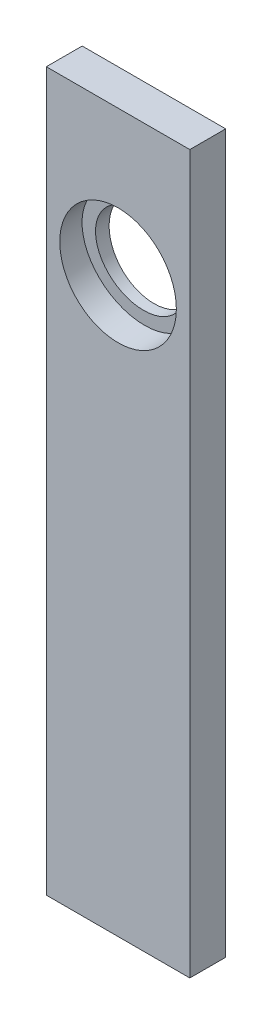
ISO-10303-21;
HEADER;
FILE_DESCRIPTION(('STEP AP214'),'2;1');
FILE_NAME('part.step','',(''),(''),'','','');
FILE_SCHEMA(('AUTOMOTIVE_DESIGN { 1 0 10303 214 1 1 1 1 }'));
ENDSEC;
DATA;
#1=APPLICATION_CONTEXT('core data for automotive mechanical design processes');
#2=APPLICATION_PROTOCOL_DEFINITION('international standard','automotive_design',2000,#1);
#3=PRODUCT_CONTEXT('',#1,'mechanical');
#4=PRODUCT('Part','Part','',(#3));
#5=PRODUCT_RELATED_PRODUCT_CATEGORY('part','',(#4));
#6=PRODUCT_DEFINITION_FORMATION('','',#4);
#7=PRODUCT_DEFINITION_CONTEXT('part definition',#1,'design');
#8=PRODUCT_DEFINITION('design','',#6,#7);
#9=PRODUCT_DEFINITION_SHAPE('','',#8);
#10=(LENGTH_UNIT() NAMED_UNIT(*) SI_UNIT(.MILLI.,.METRE.));
#11=(NAMED_UNIT(*) PLANE_ANGLE_UNIT() SI_UNIT($,.RADIAN.));
#12=(NAMED_UNIT(*) SI_UNIT($,.STERADIAN.) SOLID_ANGLE_UNIT());
#13=UNCERTAINTY_MEASURE_WITH_UNIT(LENGTH_MEASURE(1.E-05),#10,'distance_accuracy_value','');
#14=(GEOMETRIC_REPRESENTATION_CONTEXT(3) GLOBAL_UNCERTAINTY_ASSIGNED_CONTEXT((#13)) GLOBAL_UNIT_ASSIGNED_CONTEXT((#10,
#11,#12)) REPRESENTATION_CONTEXT('',''));
#15=CARTESIAN_POINT('',(0.,0.,0.));
#16=DIRECTION('',(0.,0.,1.));
#17=DIRECTION('',(1.,0.,0.));
#18=AXIS2_PLACEMENT_3D('',#15,#16,#17);
#19=CARTESIAN_POINT('',(40.,200.,20.));
#20=DIRECTION('',(-1.,0.,0.));
#21=DIRECTION('',(0.,-1.,0.));
#22=AXIS2_PLACEMENT_3D('',#19,#20,#21);
#23=PLANE('',#22);
#24=DIRECTION('',(0.,1.,0.));
#25=VECTOR('',#24,1.);
#26=CARTESIAN_POINT('',(40.,200.,0.));
#27=LINE('',#26,#25);
#28=CARTESIAN_POINT('',(40.,-200.,0.));
#29=VERTEX_POINT('',#28);
#30=CARTESIAN_POINT('',(40.,200.,0.));
#31=VERTEX_POINT('',#30);
#32=EDGE_CURVE('E110',#29,#31,#27,.T.);
#33=ORIENTED_EDGE('',*,*,#32,.T.);
#34=DIRECTION('',(0.,0.,-1.));
#35=VECTOR('',#34,1.);
#36=CARTESIAN_POINT('',(40.,200.,20.));
#37=LINE('',#36,#35);
#38=CARTESIAN_POINT('',(40.,200.,20.));
#39=VERTEX_POINT('',#38);
#40=EDGE_CURVE('E11',#39,#31,#37,.T.);
#41=ORIENTED_EDGE('',*,*,#40,.F.);
#42=DIRECTION('',(0.,1.,0.));
#43=VECTOR('',#42,1.);
#44=CARTESIAN_POINT('',(40.,200.,20.));
#45=LINE('',#44,#43);
#46=CARTESIAN_POINT('',(40.,-200.,20.));
#47=VERTEX_POINT('',#46);
#48=EDGE_CURVE('E93',#47,#39,#45,.T.);
#49=ORIENTED_EDGE('',*,*,#48,.F.);
#50=DIRECTION('',(0.,0.,-1.));
#51=VECTOR('',#50,1.);
#52=CARTESIAN_POINT('',(40.,-200.,20.));
#53=LINE('',#52,#51);
#54=EDGE_CURVE('E106',#47,#29,#53,.T.);
#55=ORIENTED_EDGE('',*,*,#54,.T.);
#56=EDGE_LOOP('',(#33,#41,#49,#55));
#57=FACE_BOUND('',#56,.T.);
#58=ADVANCED_FACE('F39',(#57),#23,.F.);
#59=CARTESIAN_POINT('',(-40.,200.,20.));
#60=DIRECTION('',(0.,-1.,0.));
#61=DIRECTION('',(0.,0.,-1.));
#62=AXIS2_PLACEMENT_3D('',#59,#60,#61);
#63=PLANE('',#62);
#64=DIRECTION('',(-1.,0.,0.));
#65=VECTOR('',#64,1.);
#66=CARTESIAN_POINT('',(-40.,200.,0.));
#67=LINE('',#66,#65);
#68=CARTESIAN_POINT('',(-40.,200.,0.));
#69=VERTEX_POINT('',#68);
#70=EDGE_CURVE('E98',#31,#69,#67,.T.);
#71=ORIENTED_EDGE('',*,*,#70,.T.);
#72=DIRECTION('',(0.,0.,-1.));
#73=VECTOR('',#72,1.);
#74=CARTESIAN_POINT('',(-40.,200.,20.));
#75=LINE('',#74,#73);
#76=CARTESIAN_POINT('',(-40.,200.,20.));
#77=VERTEX_POINT('',#76);
#78=EDGE_CURVE('E49',#77,#69,#75,.T.);
#79=ORIENTED_EDGE('',*,*,#78,.F.);
#80=DIRECTION('',(-1.,0.,0.));
#81=VECTOR('',#80,1.);
#82=CARTESIAN_POINT('',(-40.,200.,20.));
#83=LINE('',#82,#81);
#84=EDGE_CURVE('E88',#39,#77,#83,.T.);
#85=ORIENTED_EDGE('',*,*,#84,.F.);
#86=ORIENTED_EDGE('',*,*,#40,.T.);
#87=EDGE_LOOP('',(#71,#79,#85,#86));
#88=FACE_BOUND('',#87,.T.);
#89=ADVANCED_FACE('F97',(#88),#63,.F.);
#90=CARTESIAN_POINT('',(-40.,200.,20.));
#91=DIRECTION('',(1.,0.,0.));
#92=DIRECTION('',(0.,1.,0.));
#93=AXIS2_PLACEMENT_3D('',#90,#91,#92);
#94=PLANE('',#93);
#95=DIRECTION('',(0.,-1.,0.));
#96=VECTOR('',#95,1.);
#97=CARTESIAN_POINT('',(-40.,200.,0.));
#98=LINE('',#97,#96);
#99=CARTESIAN_POINT('',(-40.,-200.,0.));
#100=VERTEX_POINT('',#99);
#101=EDGE_CURVE('E75',#69,#100,#98,.T.);
#102=ORIENTED_EDGE('',*,*,#101,.T.);
#103=DIRECTION('',(0.,0.,-1.));
#104=VECTOR('',#103,1.);
#105=CARTESIAN_POINT('',(-40.,-200.,20.));
#106=LINE('',#105,#104);
#107=CARTESIAN_POINT('',(-40.,-200.,20.));
#108=VERTEX_POINT('',#107);
#109=EDGE_CURVE('E100',#108,#100,#106,.T.);
#110=ORIENTED_EDGE('',*,*,#109,.F.);
#111=DIRECTION('',(0.,-1.,0.));
#112=VECTOR('',#111,1.);
#113=CARTESIAN_POINT('',(-40.,200.,20.));
#114=LINE('',#113,#112);
#115=EDGE_CURVE('E91',#77,#108,#114,.T.);
#116=ORIENTED_EDGE('',*,*,#115,.F.);
#117=ORIENTED_EDGE('',*,*,#78,.T.);
#118=EDGE_LOOP('',(#102,#110,#116,#117));
#119=FACE_BOUND('',#118,.T.);
#120=ADVANCED_FACE('F102',(#119),#94,.F.);
#121=CARTESIAN_POINT('',(-40.,-200.,20.));
#122=DIRECTION('',(0.,1.,0.));
#123=DIRECTION('',(0.,0.,1.));
#124=AXIS2_PLACEMENT_3D('',#121,#122,#123);
#125=PLANE('',#124);
#126=DIRECTION('',(1.,0.,0.));
#127=VECTOR('',#126,1.);
#128=CARTESIAN_POINT('',(-40.,-200.,0.));
#129=LINE('',#128,#127);
#130=EDGE_CURVE('E81',#100,#29,#129,.T.);
#131=ORIENTED_EDGE('',*,*,#130,.T.);
#132=ORIENTED_EDGE('',*,*,#54,.F.);
#133=DIRECTION('',(1.,0.,0.));
#134=VECTOR('',#133,1.);
#135=CARTESIAN_POINT('',(-40.,-200.,20.));
#136=LINE('',#135,#134);
#137=EDGE_CURVE('E58',#108,#47,#136,.T.);
#138=ORIENTED_EDGE('',*,*,#137,.F.);
#139=ORIENTED_EDGE('',*,*,#109,.T.);
#140=EDGE_LOOP('',(#131,#132,#138,#139));
#141=FACE_BOUND('',#140,.T.);
#142=ADVANCED_FACE('F171',(#141),#125,.F.);
#143=CARTESIAN_POINT('',(0.,0.,20.));
#144=DIRECTION('',(0.,0.,1.));
#145=DIRECTION('',(1.,0.,0.));
#146=AXIS2_PLACEMENT_3D('',#143,#144,#145);
#147=PLANE('',#146);
#148=CARTESIAN_POINT('',(0.,119.300731880565,20.));
#149=DIRECTION('',(0.,0.,1.));
#150=DIRECTION('',(0.,1.,0.));
#151=AXIS2_PLACEMENT_3D('',#148,#149,#150);
#152=ELLIPSE('',#151,32.5793616876381,32.5);
#153=CARTESIAN_POINT('',(0.,151.880093568203,20.));
#154=VERTEX_POINT('',#153);
#155=EDGE_CURVE('E114',#154,#154,#152,.F.);
#156=ORIENTED_EDGE('',*,*,#155,.T.);
#157=EDGE_LOOP('',(#156));
#158=FACE_BOUND('',#157,.T.);
#159=ORIENTED_EDGE('',*,*,#48,.T.);
#160=ORIENTED_EDGE('',*,*,#84,.T.);
#161=ORIENTED_EDGE('',*,*,#115,.T.);
#162=ORIENTED_EDGE('',*,*,#137,.T.);
#163=EDGE_LOOP('',(#159,#160,#161,#162));
#164=FACE_BOUND('',#163,.T.);
#165=ADVANCED_FACE('F89',(#158,#164),#147,.T.);
#166=CARTESIAN_POINT('',(0.,0.,0.));
#167=DIRECTION('',(0.,0.,1.));
#168=DIRECTION('',(1.,0.,0.));
#169=AXIS2_PLACEMENT_3D('',#166,#167,#168);
#170=PLANE('',#169);
#171=CARTESIAN_POINT('',(0.,120.699268119435,0.));
#172=DIRECTION('',(0.,0.,1.));
#173=DIRECTION('',(0.,-1.,0.));
#174=AXIS2_PLACEMENT_3D('',#171,#172,#173);
#175=ELLIPSE('',#174,25.0610474520293,25.);
#176=CARTESIAN_POINT('',(0.,95.6382206674058,0.));
#177=VERTEX_POINT('',#176);
#178=EDGE_CURVE('E42',#177,#177,#175,.T.);
#179=ORIENTED_EDGE('',*,*,#178,.T.);
#180=EDGE_LOOP('',(#179));
#181=FACE_BOUND('',#180,.T.);
#182=ORIENTED_EDGE('',*,*,#32,.F.);
#183=ORIENTED_EDGE('',*,*,#130,.F.);
#184=ORIENTED_EDGE('',*,*,#101,.F.);
#185=ORIENTED_EDGE('',*,*,#70,.F.);
#186=EDGE_LOOP('',(#182,#183,#184,#185));
#187=FACE_BOUND('',#186,.T.);
#188=ADVANCED_FACE('F155',(#181,#187),#170,.F.);
#189=CARTESIAN_POINT('',(0.,117.747025493851,42.2190364973173));
#190=DIRECTION('',(0.,0.0697564737441219,-0.997564050259824));
#191=DIRECTION('',(0.,0.997564050259825,0.0697564737441219));
#192=AXIS2_PLACEMENT_3D('',#189,#190,#191);
#193=CYLINDRICAL_SURFACE('',#192,32.5);
#194=ORIENTED_EDGE('',*,*,#155,.F.);
#195=EDGE_LOOP('',(#194));
#196=FACE_BOUND('',#195,.T.);
#197=CARTESIAN_POINT('',(0.,120.1739663762,7.51216491407304));
#198=DIRECTION('',(0.,-0.0697564737441219,0.997564050259825));
#199=DIRECTION('',(0.,-0.997564050259825,-0.0697564737441219));
#200=AXIS2_PLACEMENT_3D('',#197,#198,#199);
#201=CIRCLE('',#200,32.5);
#202=CARTESIAN_POINT('',(0.,87.7531347427558,5.24507951738907));
#203=VERTEX_POINT('',#202);
#204=EDGE_CURVE('E126',#203,#203,#201,.T.);
#205=ORIENTED_EDGE('',*,*,#204,.F.);
#206=EDGE_LOOP('',(#205));
#207=FACE_BOUND('',#206,.T.);
#208=ADVANCED_FACE('F148',(#196,#207),#193,.F.);
#209=CARTESIAN_POINT('',(0.,120.1739663762,7.51216491407304));
#210=DIRECTION('',(0.,-0.0697564737441219,0.997564050259825));
#211=DIRECTION('',(0.,-0.997564050259825,-0.0697564737441219));
#212=AXIS2_PLACEMENT_3D('',#209,#210,#211);
#213=PLANE('',#212);
#214=CARTESIAN_POINT('',(0.,120.1739663762,7.51216491407304));
#215=DIRECTION('',(0.,-0.0697564737441219,0.997564050259825));
#216=DIRECTION('',(0.,-0.997564050259825,-0.0697564737441219));
#217=AXIS2_PLACEMENT_3D('',#214,#215,#216);
#218=CIRCLE('',#217,25.);
#219=CARTESIAN_POINT('',(0.,95.2348651197045,5.76825307046999));
#220=VERTEX_POINT('',#219);
#221=EDGE_CURVE('E136',#220,#220,#218,.T.);
#222=ORIENTED_EDGE('',*,*,#221,.F.);
#223=EDGE_LOOP('',(#222));
#224=FACE_BOUND('',#223,.T.);
#225=ORIENTED_EDGE('',*,*,#204,.T.);
#226=EDGE_LOOP('',(#225));
#227=FACE_BOUND('',#226,.T.);
#228=ADVANCED_FACE('F146',(#224,#227),#213,.T.);
#229=CARTESIAN_POINT('',(0.,121.085142755138,-5.51826438211021));
#230=DIRECTION('',(0.,-0.0697564737441219,0.997564050259824));
#231=DIRECTION('',(0.,-0.997564050259825,-0.0697564737441219));
#232=AXIS2_PLACEMENT_3D('',#229,#230,#231);
#233=CYLINDRICAL_SURFACE('',#232,25.);
#234=ORIENTED_EDGE('',*,*,#221,.T.);
#235=EDGE_LOOP('',(#234));
#236=FACE_BOUND('',#235,.T.);
#237=ORIENTED_EDGE('',*,*,#178,.F.);
#238=EDGE_LOOP('',(#237));
#239=FACE_BOUND('',#238,.T.);
#240=ADVANCED_FACE('F143',(#236,#239),#233,.F.);
#241=CLOSED_SHELL('',(#58,#89,#120,#142,#165,#188,#208,#228,#240));
#242=MANIFOLD_SOLID_BREP('B2',#241);
#243=ADVANCED_BREP_SHAPE_REPRESENTATION('',(#18,#242),#14);
#244=SHAPE_DEFINITION_REPRESENTATION(#9,#243);
ENDSEC;
END-ISO-10303-21;
